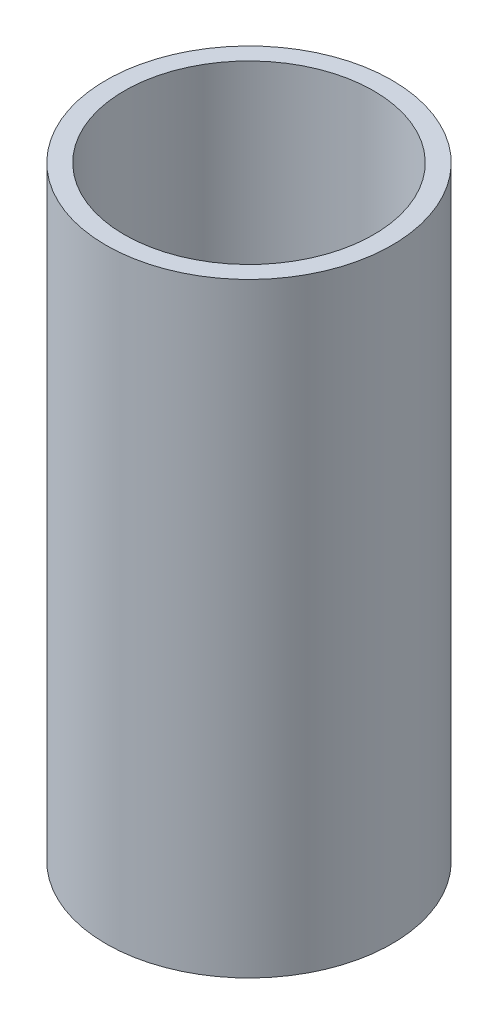
ISO-10303-21;
HEADER;
FILE_DESCRIPTION(('STEP AP214'),'2;1');
FILE_NAME('part.step','',(''),(''),'','','');
FILE_SCHEMA(('AUTOMOTIVE_DESIGN { 1 0 10303 214 1 1 1 1 }'));
ENDSEC;
DATA;
#1=APPLICATION_CONTEXT('core data for automotive mechanical design processes');
#2=APPLICATION_PROTOCOL_DEFINITION('international standard','automotive_design',2000,#1);
#3=PRODUCT_CONTEXT('',#1,'mechanical');
#4=PRODUCT('Part','Part','',(#3));
#5=PRODUCT_RELATED_PRODUCT_CATEGORY('part','',(#4));
#6=PRODUCT_DEFINITION_FORMATION('','',#4);
#7=PRODUCT_DEFINITION_CONTEXT('part definition',#1,'design');
#8=PRODUCT_DEFINITION('design','',#6,#7);
#9=PRODUCT_DEFINITION_SHAPE('','',#8);
#10=(LENGTH_UNIT() NAMED_UNIT(*) SI_UNIT(.MILLI.,.METRE.));
#11=(NAMED_UNIT(*) PLANE_ANGLE_UNIT() SI_UNIT($,.RADIAN.));
#12=(NAMED_UNIT(*) SI_UNIT($,.STERADIAN.) SOLID_ANGLE_UNIT());
#13=UNCERTAINTY_MEASURE_WITH_UNIT(LENGTH_MEASURE(1.E-05),#10,'distance_accuracy_value','');
#14=(GEOMETRIC_REPRESENTATION_CONTEXT(3) GLOBAL_UNCERTAINTY_ASSIGNED_CONTEXT((#13)) GLOBAL_UNIT_ASSIGNED_CONTEXT((#10,
#11,#12)) REPRESENTATION_CONTEXT('',''));
#15=CARTESIAN_POINT('',(0.,0.,0.));
#16=DIRECTION('',(0.,0.,1.));
#17=DIRECTION('',(1.,0.,0.));
#18=AXIS2_PLACEMENT_3D('',#15,#16,#17);
#19=CARTESIAN_POINT('',(0.,165.,0.));
#20=DIRECTION('',(0.,-1.,0.));
#21=DIRECTION('',(0.,0.,-1.));
#22=AXIS2_PLACEMENT_3D('',#19,#20,#21);
#23=CYLINDRICAL_SURFACE('',#22,39.);
#24=CARTESIAN_POINT('',(0.,165.,0.));
#25=DIRECTION('',(0.,1.,0.));
#26=DIRECTION('',(0.,0.,1.));
#27=AXIS2_PLACEMENT_3D('',#24,#25,#26);
#28=CIRCLE('',#27,39.);
#29=CARTESIAN_POINT('',(0.,165.,39.));
#30=VERTEX_POINT('',#29);
#31=EDGE_CURVE('E10',#30,#30,#28,.T.);
#32=ORIENTED_EDGE('',*,*,#31,.F.);
#33=EDGE_LOOP('',(#32));
#34=FACE_BOUND('',#33,.T.);
#35=CARTESIAN_POINT('',(0.,0.,0.));
#36=DIRECTION('',(0.,1.,0.));
#37=DIRECTION('',(0.,0.,1.));
#38=AXIS2_PLACEMENT_3D('',#35,#36,#37);
#39=CIRCLE('',#38,39.);
#40=CARTESIAN_POINT('',(0.,0.,39.));
#41=VERTEX_POINT('',#40);
#42=EDGE_CURVE('E42',#41,#41,#39,.T.);
#43=ORIENTED_EDGE('',*,*,#42,.T.);
#44=EDGE_LOOP('',(#43));
#45=FACE_BOUND('',#44,.T.);
#46=ADVANCED_FACE('F39',(#34,#45),#23,.T.);
#47=CARTESIAN_POINT('',(0.,165.,0.));
#48=DIRECTION('',(0.,1.,0.));
#49=DIRECTION('',(0.,0.,1.));
#50=AXIS2_PLACEMENT_3D('',#47,#48,#49);
#51=PLANE('',#50);
#52=CARTESIAN_POINT('',(0.,165.,0.));
#53=DIRECTION('',(0.,1.,0.));
#54=DIRECTION('',(0.,0.,1.));
#55=AXIS2_PLACEMENT_3D('',#52,#53,#54);
#56=CIRCLE('',#55,34.);
#57=CARTESIAN_POINT('',(0.,165.,34.));
#58=VERTEX_POINT('',#57);
#59=EDGE_CURVE('E61',#58,#58,#56,.T.);
#60=ORIENTED_EDGE('',*,*,#59,.F.);
#61=EDGE_LOOP('',(#60));
#62=FACE_BOUND('',#61,.T.);
#63=ORIENTED_EDGE('',*,*,#31,.T.);
#64=EDGE_LOOP('',(#63));
#65=FACE_BOUND('',#64,.T.);
#66=ADVANCED_FACE('F78',(#62,#65),#51,.T.);
#67=CARTESIAN_POINT('',(0.,0.,0.));
#68=DIRECTION('',(0.,1.,0.));
#69=DIRECTION('',(0.,0.,1.));
#70=AXIS2_PLACEMENT_3D('',#67,#68,#69);
#71=PLANE('',#70);
#72=CARTESIAN_POINT('',(0.,0.,0.));
#73=DIRECTION('',(0.,-1.,0.));
#74=DIRECTION('',(0.,0.,-1.));
#75=AXIS2_PLACEMENT_3D('',#72,#73,#74);
#76=CIRCLE('',#75,31.5);
#77=CARTESIAN_POINT('',(0.,0.,-31.5));
#78=VERTEX_POINT('',#77);
#79=EDGE_CURVE('E51',#78,#78,#76,.T.);
#80=ORIENTED_EDGE('',*,*,#79,.F.);
#81=EDGE_LOOP('',(#80));
#82=FACE_BOUND('',#81,.T.);
#83=ORIENTED_EDGE('',*,*,#42,.F.);
#84=EDGE_LOOP('',(#83));
#85=FACE_BOUND('',#84,.T.);
#86=ADVANCED_FACE('F80',(#82,#85),#71,.F.);
#87=CARTESIAN_POINT('',(0.,25.,0.));
#88=DIRECTION('',(0.,-1.,0.));
#89=DIRECTION('',(0.,0.,-1.));
#90=AXIS2_PLACEMENT_3D('',#87,#88,#89);
#91=CYLINDRICAL_SURFACE('',#90,31.5);
#92=CARTESIAN_POINT('',(0.,25.,0.));
#93=DIRECTION('',(0.,-1.,0.));
#94=DIRECTION('',(0.,0.,-1.));
#95=AXIS2_PLACEMENT_3D('',#92,#93,#94);
#96=CIRCLE('',#95,31.5);
#97=CARTESIAN_POINT('',(0.,25.,-31.5));
#98=VERTEX_POINT('',#97);
#99=EDGE_CURVE('E56',#98,#98,#96,.T.);
#100=ORIENTED_EDGE('',*,*,#99,.F.);
#101=EDGE_LOOP('',(#100));
#102=FACE_BOUND('',#101,.T.);
#103=ORIENTED_EDGE('',*,*,#79,.T.);
#104=EDGE_LOOP('',(#103));
#105=FACE_BOUND('',#104,.T.);
#106=ADVANCED_FACE('F86',(#102,#105),#91,.F.);
#107=CARTESIAN_POINT('',(0.,25.,0.));
#108=DIRECTION('',(0.,1.,0.));
#109=DIRECTION('',(0.,0.,1.));
#110=AXIS2_PLACEMENT_3D('',#107,#108,#109);
#111=PLANE('',#110);
#112=CARTESIAN_POINT('',(0.,25.,0.));
#113=DIRECTION('',(0.,1.,0.));
#114=DIRECTION('',(0.,0.,1.));
#115=AXIS2_PLACEMENT_3D('',#112,#113,#114);
#116=CIRCLE('',#115,34.);
#117=CARTESIAN_POINT('',(0.,25.,34.));
#118=VERTEX_POINT('',#117);
#119=EDGE_CURVE('E60',#118,#118,#116,.T.);
#120=ORIENTED_EDGE('',*,*,#119,.T.);
#121=EDGE_LOOP('',(#120));
#122=FACE_BOUND('',#121,.T.);
#123=ORIENTED_EDGE('',*,*,#99,.T.);
#124=EDGE_LOOP('',(#123));
#125=FACE_BOUND('',#124,.T.);
#126=ADVANCED_FACE('F69',(#122,#125),#111,.T.);
#127=CARTESIAN_POINT('',(0.,25.,0.));
#128=DIRECTION('',(0.,1.,0.));
#129=DIRECTION('',(0.,0.,1.));
#130=AXIS2_PLACEMENT_3D('',#127,#128,#129);
#131=CYLINDRICAL_SURFACE('',#130,34.);
#132=ORIENTED_EDGE('',*,*,#119,.F.);
#133=EDGE_LOOP('',(#132));
#134=FACE_BOUND('',#133,.T.);
#135=ORIENTED_EDGE('',*,*,#59,.T.);
#136=EDGE_LOOP('',(#135));
#137=FACE_BOUND('',#136,.T.);
#138=ADVANCED_FACE('F72',(#134,#137),#131,.F.);
#139=CLOSED_SHELL('',(#46,#66,#86,#106,#126,#138));
#140=MANIFOLD_SOLID_BREP('B2',#139);
#141=ADVANCED_BREP_SHAPE_REPRESENTATION('',(#18,#140),#14);
#142=SHAPE_DEFINITION_REPRESENTATION(#9,#141);
ENDSEC;
END-ISO-10303-21;
